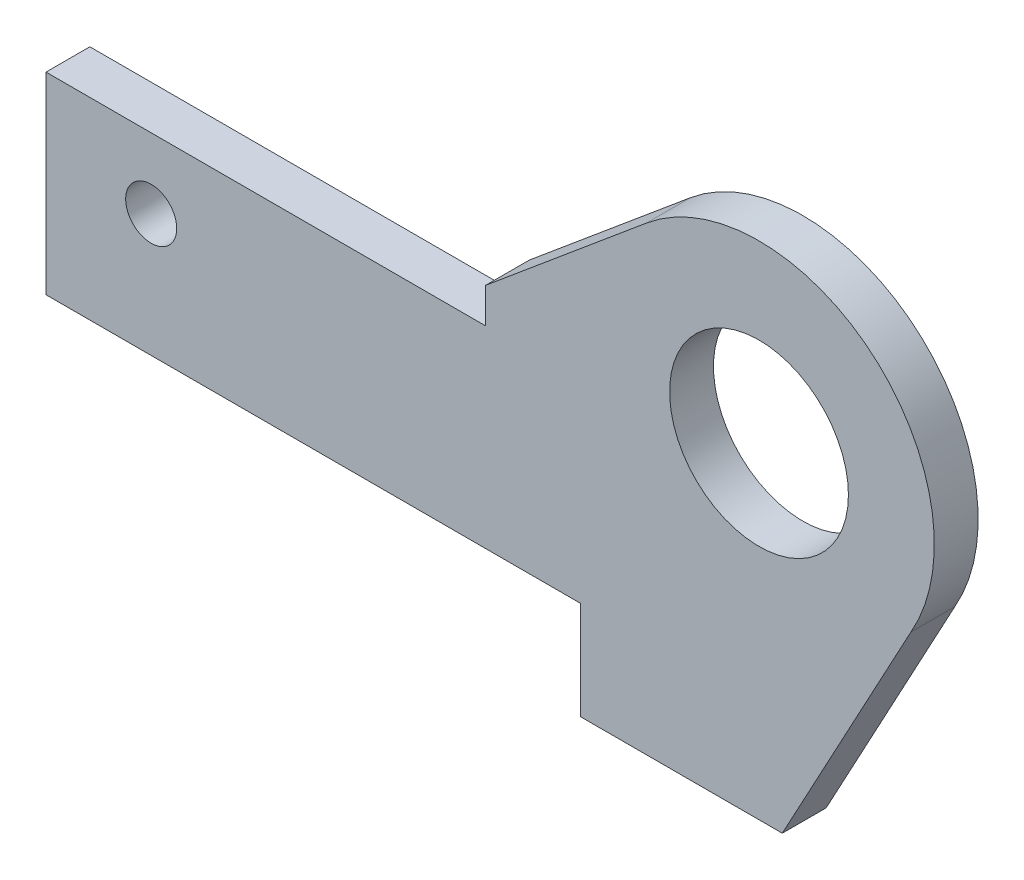
ISO-10303-21;
HEADER;
FILE_DESCRIPTION(('STEP AP214'),'2;1');
FILE_NAME('part.step','',(''),(''),'','','');
FILE_SCHEMA(('AUTOMOTIVE_DESIGN { 1 0 10303 214 1 1 1 1 }'));
ENDSEC;
DATA;
#1=APPLICATION_CONTEXT('core data for automotive mechanical design processes');
#2=APPLICATION_PROTOCOL_DEFINITION('international standard','automotive_design',2000,#1);
#3=PRODUCT_CONTEXT('',#1,'mechanical');
#4=PRODUCT('Part','Part','',(#3));
#5=PRODUCT_RELATED_PRODUCT_CATEGORY('part','',(#4));
#6=PRODUCT_DEFINITION_FORMATION('','',#4);
#7=PRODUCT_DEFINITION_CONTEXT('part definition',#1,'design');
#8=PRODUCT_DEFINITION('design','',#6,#7);
#9=PRODUCT_DEFINITION_SHAPE('','',#8);
#10=(LENGTH_UNIT() NAMED_UNIT(*) SI_UNIT(.MILLI.,.METRE.));
#11=(NAMED_UNIT(*) PLANE_ANGLE_UNIT() SI_UNIT($,.RADIAN.));
#12=(NAMED_UNIT(*) SI_UNIT($,.STERADIAN.) SOLID_ANGLE_UNIT());
#13=UNCERTAINTY_MEASURE_WITH_UNIT(LENGTH_MEASURE(1.E-05),#10,'distance_accuracy_value','');
#14=(GEOMETRIC_REPRESENTATION_CONTEXT(3) GLOBAL_UNCERTAINTY_ASSIGNED_CONTEXT((#13)) GLOBAL_UNIT_ASSIGNED_CONTEXT((#10,
#11,#12)) REPRESENTATION_CONTEXT('',''));
#15=CARTESIAN_POINT('',(0.,0.,0.));
#16=DIRECTION('',(0.,0.,1.));
#17=DIRECTION('',(1.,0.,0.));
#18=AXIS2_PLACEMENT_3D('',#15,#16,#17);
#19=CARTESIAN_POINT('',(-28.7909,-23.622,-0.00100000000000013));
#20=DIRECTION('',(0.,1.,0.));
#21=DIRECTION('',(0.,0.,1.));
#22=AXIS2_PLACEMENT_3D('',#19,#20,#21);
#23=PLANE('',#22);
#24=DIRECTION('',(0.,0.,1.));
#25=VECTOR('',#24,1.);
#26=CARTESIAN_POINT('',(-12.9159,-23.622,0.));
#27=LINE('',#26,#25);
#28=CARTESIAN_POINT('',(-12.9159,-23.622,0.));
#29=VERTEX_POINT('',#28);
#30=CARTESIAN_POINT('',(-12.9159,-23.622,3.175));
#31=VERTEX_POINT('',#30);
#32=EDGE_CURVE('E178',#29,#31,#27,.T.);
#33=ORIENTED_EDGE('',*,*,#32,.F.);
#34=DIRECTION('',(1.,0.,0.));
#35=VECTOR('',#34,1.);
#36=CARTESIAN_POINT('',(-28.7909,-23.622,0.));
#37=LINE('',#36,#35);
#38=CARTESIAN_POINT('',(1.6868980115813,-23.622,0.));
#39=VERTEX_POINT('',#38);
#40=EDGE_CURVE('E186',#29,#39,#37,.T.);
#41=ORIENTED_EDGE('',*,*,#40,.T.);
#42=DIRECTION('',(0.,0.,1.));
#43=VECTOR('',#42,1.);
#44=CARTESIAN_POINT('',(1.6868980115813,-23.622,-0.00100000000000013));
#45=LINE('',#44,#43);
#46=CARTESIAN_POINT('',(1.6868980115813,-23.622,3.175));
#47=VERTEX_POINT('',#46);
#48=EDGE_CURVE('E108',#39,#47,#45,.T.);
#49=ORIENTED_EDGE('',*,*,#48,.T.);
#50=DIRECTION('',(-1.,0.,0.));
#51=VECTOR('',#50,1.);
#52=CARTESIAN_POINT('',(-28.7909,-23.622,3.175));
#53=LINE('',#52,#51);
#54=EDGE_CURVE('E187',#47,#31,#53,.T.);
#55=ORIENTED_EDGE('',*,*,#54,.T.);
#56=EDGE_LOOP('',(#33,#41,#49,#55));
#57=FACE_BOUND('',#56,.T.);
#58=ADVANCED_FACE('F91',(#57),#23,.F.);
#59=CARTESIAN_POINT('',(11.1741749721623,-6.02418496639954,3.175));
#60=DIRECTION('',(-0.88023023603326,0.474546869732413,0.));
#61=DIRECTION('',(-0.474546869732413,-0.88023023603326,0.));
#62=AXIS2_PLACEMENT_3D('',#59,#60,#61);
#63=PLANE('',#62);
#64=DIRECTION('',(0.474546869732413,0.88023023603326,0.));
#65=VECTOR('',#64,1.);
#66=CARTESIAN_POINT('',(11.1741749721623,-6.02418496639954,3.175));
#67=LINE('',#66,#65);
#68=CARTESIAN_POINT('',(10.9985226280624,-6.35000000000001,3.175));
#69=VERTEX_POINT('',#68);
#70=EDGE_CURVE('E144',#47,#69,#67,.T.);
#71=ORIENTED_EDGE('',*,*,#70,.F.);
#72=ORIENTED_EDGE('',*,*,#48,.F.);
#73=DIRECTION('',(0.474546869732413,0.88023023603326,0.));
#74=VECTOR('',#73,1.);
#75=CARTESIAN_POINT('',(11.1741749721623,-6.02418496639954,0.));
#76=LINE('',#75,#74);
#77=CARTESIAN_POINT('',(10.9985226280624,-6.35000000000001,0.));
#78=VERTEX_POINT('',#77);
#79=EDGE_CURVE('E194',#39,#78,#76,.T.);
#80=ORIENTED_EDGE('',*,*,#79,.T.);
#81=DIRECTION('',(0.,0.,-1.));
#82=VECTOR('',#81,1.);
#83=CARTESIAN_POINT('',(10.9985226280624,-6.35000000000001,3.175));
#84=LINE('',#83,#82);
#85=EDGE_CURVE('E12',#69,#78,#84,.T.);
#86=ORIENTED_EDGE('',*,*,#85,.F.);
#87=EDGE_LOOP('',(#71,#72,#80,#86));
#88=FACE_BOUND('',#87,.T.);
#89=ADVANCED_FACE('F264',(#88),#63,.F.);
#90=CARTESIAN_POINT('',(-8.14102564102564,9.74749719221109,3.175));
#91=DIRECTION('',(-0.641025641025641,0.767519463953629,0.));
#92=DIRECTION('',(-0.767519463953629,-0.641025641025641,0.));
#93=AXIS2_PLACEMENT_3D('',#90,#91,#92);
#94=PLANE('',#93);
#95=DIRECTION('',(0.767519463953629,0.641025641025641,0.));
#96=VECTOR('',#95,1.);
#97=CARTESIAN_POINT('',(-8.14102564102564,9.74749719221109,0.));
#98=LINE('',#97,#96);
#99=CARTESIAN_POINT('',(-19.812,0.,0.));
#100=VERTEX_POINT('',#99);
#101=CARTESIAN_POINT('',(-8.14102564102564,9.74749719221109,0.));
#102=VERTEX_POINT('',#101);
#103=EDGE_CURVE('E212',#100,#102,#98,.T.);
#104=ORIENTED_EDGE('',*,*,#103,.F.);
#105=DIRECTION('',(0.,0.,-1.));
#106=VECTOR('',#105,1.);
#107=CARTESIAN_POINT('',(-19.812,0.,3.175));
#108=LINE('',#107,#106);
#109=CARTESIAN_POINT('',(-19.812,0.,3.175));
#110=VERTEX_POINT('',#109);
#111=EDGE_CURVE('E219',#110,#100,#108,.T.);
#112=ORIENTED_EDGE('',*,*,#111,.F.);
#113=DIRECTION('',(0.767519463953629,0.641025641025641,0.));
#114=VECTOR('',#113,1.);
#115=CARTESIAN_POINT('',(-8.14102564102564,9.74749719221109,3.175));
#116=LINE('',#115,#114);
#117=CARTESIAN_POINT('',(-8.14102564102564,9.74749719221109,3.175));
#118=VERTEX_POINT('',#117);
#119=EDGE_CURVE('E203',#110,#118,#116,.T.);
#120=ORIENTED_EDGE('',*,*,#119,.T.);
#121=DIRECTION('',(0.,0.,-1.));
#122=VECTOR('',#121,1.);
#123=CARTESIAN_POINT('',(-8.14102564102564,9.74749719221109,3.175));
#124=LINE('',#123,#122);
#125=EDGE_CURVE('E100',#118,#102,#124,.T.);
#126=ORIENTED_EDGE('',*,*,#125,.T.);
#127=EDGE_LOOP('',(#104,#112,#120,#126));
#128=FACE_BOUND('',#127,.T.);
#129=ADVANCED_FACE('F234',(#128),#94,.T.);
#130=CARTESIAN_POINT('',(-19.812,0.,3.175));
#131=DIRECTION('',(1.,0.,0.));
#132=DIRECTION('',(0.,0.,-1.));
#133=AXIS2_PLACEMENT_3D('',#130,#131,#132);
#134=PLANE('',#133);
#135=DIRECTION('',(0.,-1.,0.));
#136=VECTOR('',#135,1.);
#137=CARTESIAN_POINT('',(-19.812,0.,0.));
#138=LINE('',#137,#136);
#139=CARTESIAN_POINT('',(-19.812,-2.54,0.));
#140=VERTEX_POINT('',#139);
#141=EDGE_CURVE('E138',#100,#140,#138,.T.);
#142=ORIENTED_EDGE('',*,*,#141,.T.);
#143=DIRECTION('',(0.,0.,-1.));
#144=VECTOR('',#143,1.);
#145=CARTESIAN_POINT('',(-19.812,-2.54,3.175));
#146=LINE('',#145,#144);
#147=CARTESIAN_POINT('',(-19.812,-2.54,3.175));
#148=VERTEX_POINT('',#147);
#149=EDGE_CURVE('E210',#148,#140,#146,.T.);
#150=ORIENTED_EDGE('',*,*,#149,.F.);
#151=DIRECTION('',(0.,-1.,0.));
#152=VECTOR('',#151,1.);
#153=CARTESIAN_POINT('',(-19.812,0.,3.175));
#154=LINE('',#153,#152);
#155=EDGE_CURVE('E117',#110,#148,#154,.T.);
#156=ORIENTED_EDGE('',*,*,#155,.F.);
#157=ORIENTED_EDGE('',*,*,#111,.T.);
#158=EDGE_LOOP('',(#142,#150,#156,#157));
#159=FACE_BOUND('',#158,.T.);
#160=ADVANCED_FACE('F259',(#159),#134,.F.);
#161=CARTESIAN_POINT('',(0.,-2.54,3.175));
#162=DIRECTION('',(0.,-1.,0.));
#163=DIRECTION('',(1.,0.,0.));
#164=AXIS2_PLACEMENT_3D('',#161,#162,#163);
#165=PLANE('',#164);
#166=DIRECTION('',(-1.,0.,0.));
#167=VECTOR('',#166,1.);
#168=CARTESIAN_POINT('',(0.,-2.54,0.));
#169=LINE('',#168,#167);
#170=CARTESIAN_POINT('',(-51.6509,-2.54,0.));
#171=VERTEX_POINT('',#170);
#172=EDGE_CURVE('E204',#140,#171,#169,.T.);
#173=ORIENTED_EDGE('',*,*,#172,.T.);
#174=DIRECTION('',(0.,0.,-1.));
#175=VECTOR('',#174,1.);
#176=CARTESIAN_POINT('',(-51.6509,-2.54,0.));
#177=LINE('',#176,#175);
#178=CARTESIAN_POINT('',(-51.6509,-2.54,3.175));
#179=VERTEX_POINT('',#178);
#180=EDGE_CURVE('E402',#179,#171,#177,.T.);
#181=ORIENTED_EDGE('',*,*,#180,.F.);
#182=DIRECTION('',(-1.,0.,0.));
#183=VECTOR('',#182,1.);
#184=CARTESIAN_POINT('',(0.,-2.54,3.175));
#185=LINE('',#184,#183);
#186=EDGE_CURVE('E208',#148,#179,#185,.T.);
#187=ORIENTED_EDGE('',*,*,#186,.F.);
#188=ORIENTED_EDGE('',*,*,#149,.T.);
#189=EDGE_LOOP('',(#173,#181,#187,#188));
#190=FACE_BOUND('',#189,.T.);
#191=ADVANCED_FACE('F253',(#190),#165,.F.);
#192=CARTESIAN_POINT('',(0.,0.,0.));
#193=DIRECTION('',(0.,0.,1.));
#194=DIRECTION('',(1.,0.,0.));
#195=AXIS2_PLACEMENT_3D('',#192,#193,#194);
#196=PLANE('',#195);
#197=CARTESIAN_POINT('',(-44.0309,-7.62,0.));
#198=DIRECTION('',(0.,0.,-1.));
#199=DIRECTION('',(-1.,0.,0.));
#200=AXIS2_PLACEMENT_3D('',#197,#198,#199);
#201=CIRCLE('',#200,1.85);
#202=CARTESIAN_POINT('',(-45.8809,-7.62,0.));
#203=VERTEX_POINT('',#202);
#204=EDGE_CURVE('E389',#203,#203,#201,.T.);
#205=ORIENTED_EDGE('',*,*,#204,.F.);
#206=EDGE_LOOP('',(#205));
#207=FACE_BOUND('',#206,.T.);
#208=DIRECTION('',(0.,-1.,0.));
#209=VECTOR('',#208,1.);
#210=CARTESIAN_POINT('',(-12.9159,-16.51,0.));
#211=LINE('',#210,#209);
#212=CARTESIAN_POINT('',(-12.9159,-16.51,0.));
#213=VERTEX_POINT('',#212);
#214=EDGE_CURVE('E174',#213,#29,#211,.T.);
#215=ORIENTED_EDGE('',*,*,#214,.F.);
#216=DIRECTION('',(1.,0.,0.));
#217=VECTOR('',#216,1.);
#218=CARTESIAN_POINT('',(-51.6509,-16.51,0.));
#219=LINE('',#218,#217);
#220=CARTESIAN_POINT('',(-51.6509,-16.51,0.));
#221=VERTEX_POINT('',#220);
#222=EDGE_CURVE('E198',#221,#213,#219,.T.);
#223=ORIENTED_EDGE('',*,*,#222,.F.);
#224=DIRECTION('',(0.,-1.,0.));
#225=VECTOR('',#224,1.);
#226=CARTESIAN_POINT('',(-51.6509,-2.54,0.));
#227=LINE('',#226,#225);
#228=EDGE_CURVE('E391',#171,#221,#227,.T.);
#229=ORIENTED_EDGE('',*,*,#228,.F.);
#230=ORIENTED_EDGE('',*,*,#172,.F.);
#231=ORIENTED_EDGE('',*,*,#141,.F.);
#232=ORIENTED_EDGE('',*,*,#103,.T.);
#233=CARTESIAN_POINT('',(0.,0.,0.));
#234=DIRECTION('',(0.,0.,1.));
#235=DIRECTION('',(1.,0.,0.));
#236=AXIS2_PLACEMENT_3D('',#233,#234,#235);
#237=CIRCLE('',#236,12.7);
#238=EDGE_CURVE('E225',#78,#102,#237,.T.);
#239=ORIENTED_EDGE('',*,*,#238,.F.);
#240=ORIENTED_EDGE('',*,*,#79,.F.);
#241=ORIENTED_EDGE('',*,*,#40,.F.);
#242=EDGE_LOOP('',(#215,#223,#229,#230,#231,#232,#239,#240,#241));
#243=FACE_BOUND('',#242,.T.);
#244=CARTESIAN_POINT('',(0.,0.,0.));
#245=DIRECTION('',(0.,0.,1.));
#246=DIRECTION('',(1.,0.,0.));
#247=AXIS2_PLACEMENT_3D('',#244,#245,#246);
#248=CIRCLE('',#247,6.477);
#249=CARTESIAN_POINT('',(6.477,0.,0.));
#250=VERTEX_POINT('',#249);
#251=EDGE_CURVE('E196',#250,#250,#248,.T.);
#252=ORIENTED_EDGE('',*,*,#251,.T.);
#253=EDGE_LOOP('',(#252));
#254=FACE_BOUND('',#253,.T.);
#255=ADVANCED_FACE('F191',(#207,#243,#254),#196,.F.);
#256=CARTESIAN_POINT('',(0.,0.,3.175));
#257=DIRECTION('',(0.,0.,1.));
#258=DIRECTION('',(1.,0.,0.));
#259=AXIS2_PLACEMENT_3D('',#256,#257,#258);
#260=PLANE('',#259);
#261=DIRECTION('',(1.,0.,0.));
#262=VECTOR('',#261,1.);
#263=CARTESIAN_POINT('',(-51.6509,-16.51,3.175));
#264=LINE('',#263,#262);
#265=CARTESIAN_POINT('',(-51.6509,-16.51,3.175));
#266=VERTEX_POINT('',#265);
#267=CARTESIAN_POINT('',(-12.9159,-16.51,3.175));
#268=VERTEX_POINT('',#267);
#269=EDGE_CURVE('E239',#266,#268,#264,.T.);
#270=ORIENTED_EDGE('',*,*,#269,.T.);
#271=DIRECTION('',(0.,1.,0.));
#272=VECTOR('',#271,1.);
#273=CARTESIAN_POINT('',(-12.9159,-16.51,3.175));
#274=LINE('',#273,#272);
#275=EDGE_CURVE('E188',#31,#268,#274,.T.);
#276=ORIENTED_EDGE('',*,*,#275,.F.);
#277=ORIENTED_EDGE('',*,*,#54,.F.);
#278=ORIENTED_EDGE('',*,*,#70,.T.);
#279=CARTESIAN_POINT('',(0.,0.,3.175));
#280=DIRECTION('',(0.,0.,1.));
#281=DIRECTION('',(1.,0.,0.));
#282=AXIS2_PLACEMENT_3D('',#279,#280,#281);
#283=CIRCLE('',#282,12.7);
#284=EDGE_CURVE('E213',#69,#118,#283,.T.);
#285=ORIENTED_EDGE('',*,*,#284,.T.);
#286=ORIENTED_EDGE('',*,*,#119,.F.);
#287=ORIENTED_EDGE('',*,*,#155,.T.);
#288=ORIENTED_EDGE('',*,*,#186,.T.);
#289=DIRECTION('',(0.,1.,0.));
#290=VECTOR('',#289,1.);
#291=CARTESIAN_POINT('',(-51.6509,-2.54,3.175));
#292=LINE('',#291,#290);
#293=EDGE_CURVE('E399',#266,#179,#292,.T.);
#294=ORIENTED_EDGE('',*,*,#293,.F.);
#295=EDGE_LOOP('',(#270,#276,#277,#278,#285,#286,#287,#288,#294));
#296=FACE_BOUND('',#295,.T.);
#297=CARTESIAN_POINT('',(-44.0309,-7.62,3.175));
#298=DIRECTION('',(0.,0.,1.));
#299=DIRECTION('',(1.,0.,0.));
#300=AXIS2_PLACEMENT_3D('',#297,#298,#299);
#301=CIRCLE('',#300,1.84999999999999);
#302=CARTESIAN_POINT('',(-42.1809,-7.62,3.175));
#303=VERTEX_POINT('',#302);
#304=EDGE_CURVE('E95',#303,#303,#301,.T.);
#305=ORIENTED_EDGE('',*,*,#304,.F.);
#306=EDGE_LOOP('',(#305));
#307=FACE_BOUND('',#306,.T.);
#308=CARTESIAN_POINT('',(0.,0.,3.175));
#309=DIRECTION('',(0.,0.,1.));
#310=DIRECTION('',(1.,0.,0.));
#311=AXIS2_PLACEMENT_3D('',#308,#309,#310);
#312=CIRCLE('',#311,6.477);
#313=CARTESIAN_POINT('',(6.477,0.,3.175));
#314=VERTEX_POINT('',#313);
#315=EDGE_CURVE('E222',#314,#314,#312,.T.);
#316=ORIENTED_EDGE('',*,*,#315,.F.);
#317=EDGE_LOOP('',(#316));
#318=FACE_BOUND('',#317,.T.);
#319=ADVANCED_FACE('F235',(#296,#307,#318),#260,.T.);
#320=CARTESIAN_POINT('',(0.,0.,3.175));
#321=DIRECTION('',(0.,0.,-1.));
#322=DIRECTION('',(-1.,0.,0.));
#323=AXIS2_PLACEMENT_3D('',#320,#321,#322);
#324=CYLINDRICAL_SURFACE('',#323,6.477);
#325=ORIENTED_EDGE('',*,*,#315,.T.);
#326=EDGE_LOOP('',(#325));
#327=FACE_BOUND('',#326,.T.);
#328=ORIENTED_EDGE('',*,*,#251,.F.);
#329=EDGE_LOOP('',(#328));
#330=FACE_BOUND('',#329,.T.);
#331=ADVANCED_FACE('F241',(#327,#330),#324,.F.);
#332=CARTESIAN_POINT('',(0.,0.,3.175));
#333=DIRECTION('',(0.,0.,-1.));
#334=DIRECTION('',(-1.,0.,0.));
#335=AXIS2_PLACEMENT_3D('',#332,#333,#334);
#336=CYLINDRICAL_SURFACE('',#335,12.7);
#337=ORIENTED_EDGE('',*,*,#284,.F.);
#338=ORIENTED_EDGE('',*,*,#85,.T.);
#339=ORIENTED_EDGE('',*,*,#238,.T.);
#340=ORIENTED_EDGE('',*,*,#125,.F.);
#341=EDGE_LOOP('',(#337,#338,#339,#340));
#342=FACE_BOUND('',#341,.T.);
#343=ADVANCED_FACE('F93',(#342),#336,.T.);
#344=CARTESIAN_POINT('',(-51.6509,-16.51,0.));
#345=DIRECTION('',(0.,1.,0.));
#346=DIRECTION('',(0.,0.,1.));
#347=AXIS2_PLACEMENT_3D('',#344,#345,#346);
#348=PLANE('',#347);
#349=ORIENTED_EDGE('',*,*,#222,.T.);
#350=DIRECTION('',(0.,0.,-1.));
#351=VECTOR('',#350,1.);
#352=CARTESIAN_POINT('',(-12.9159,-16.51,0.));
#353=LINE('',#352,#351);
#354=EDGE_CURVE('E181',#268,#213,#353,.T.);
#355=ORIENTED_EDGE('',*,*,#354,.F.);
#356=ORIENTED_EDGE('',*,*,#269,.F.);
#357=DIRECTION('',(0.,0.,1.));
#358=VECTOR('',#357,1.);
#359=CARTESIAN_POINT('',(-51.6509,-16.51,0.));
#360=LINE('',#359,#358);
#361=EDGE_CURVE('E397',#221,#266,#360,.T.);
#362=ORIENTED_EDGE('',*,*,#361,.F.);
#363=EDGE_LOOP('',(#349,#355,#356,#362));
#364=FACE_BOUND('',#363,.T.);
#365=ADVANCED_FACE('F250',(#364),#348,.F.);
#366=CARTESIAN_POINT('',(-51.6509,0.,0.));
#367=DIRECTION('',(-1.,0.,0.));
#368=DIRECTION('',(0.,0.,1.));
#369=AXIS2_PLACEMENT_3D('',#366,#367,#368);
#370=PLANE('',#369);
#371=ORIENTED_EDGE('',*,*,#228,.T.);
#372=ORIENTED_EDGE('',*,*,#361,.T.);
#373=ORIENTED_EDGE('',*,*,#293,.T.);
#374=ORIENTED_EDGE('',*,*,#180,.T.);
#375=EDGE_LOOP('',(#371,#372,#373,#374));
#376=FACE_BOUND('',#375,.T.);
#377=ADVANCED_FACE('F274',(#376),#370,.T.);
#378=CARTESIAN_POINT('',(-44.0309,-7.62,0.));
#379=DIRECTION('',(0.,0.,-1.));
#380=DIRECTION('',(-1.,0.,0.));
#381=AXIS2_PLACEMENT_3D('',#378,#379,#380);
#382=CYLINDRICAL_SURFACE('',#381,1.84999999999999);
#383=ORIENTED_EDGE('',*,*,#304,.T.);
#384=EDGE_LOOP('',(#383));
#385=FACE_BOUND('',#384,.T.);
#386=ORIENTED_EDGE('',*,*,#204,.T.);
#387=EDGE_LOOP('',(#386));
#388=FACE_BOUND('',#387,.T.);
#389=ADVANCED_FACE('F278',(#385,#388),#382,.F.);
#390=CARTESIAN_POINT('',(-12.9159,0.,0.));
#391=DIRECTION('',(-1.,0.,0.));
#392=DIRECTION('',(0.,0.,1.));
#393=AXIS2_PLACEMENT_3D('',#390,#391,#392);
#394=PLANE('',#393);
#395=ORIENTED_EDGE('',*,*,#214,.T.);
#396=ORIENTED_EDGE('',*,*,#32,.T.);
#397=ORIENTED_EDGE('',*,*,#275,.T.);
#398=ORIENTED_EDGE('',*,*,#354,.T.);
#399=EDGE_LOOP('',(#395,#396,#397,#398));
#400=FACE_BOUND('',#399,.T.);
#401=ADVANCED_FACE('F176',(#400),#394,.T.);
#402=CLOSED_SHELL('',(#58,#89,#129,#160,#191,#255,#319,#331,#343,#365,#377,#389,#401));
#403=MANIFOLD_SOLID_BREP('B2',#402);
#404=ADVANCED_BREP_SHAPE_REPRESENTATION('',(#18,#403),#14);
#405=SHAPE_DEFINITION_REPRESENTATION(#9,#404);
ENDSEC;
END-ISO-10303-21;
